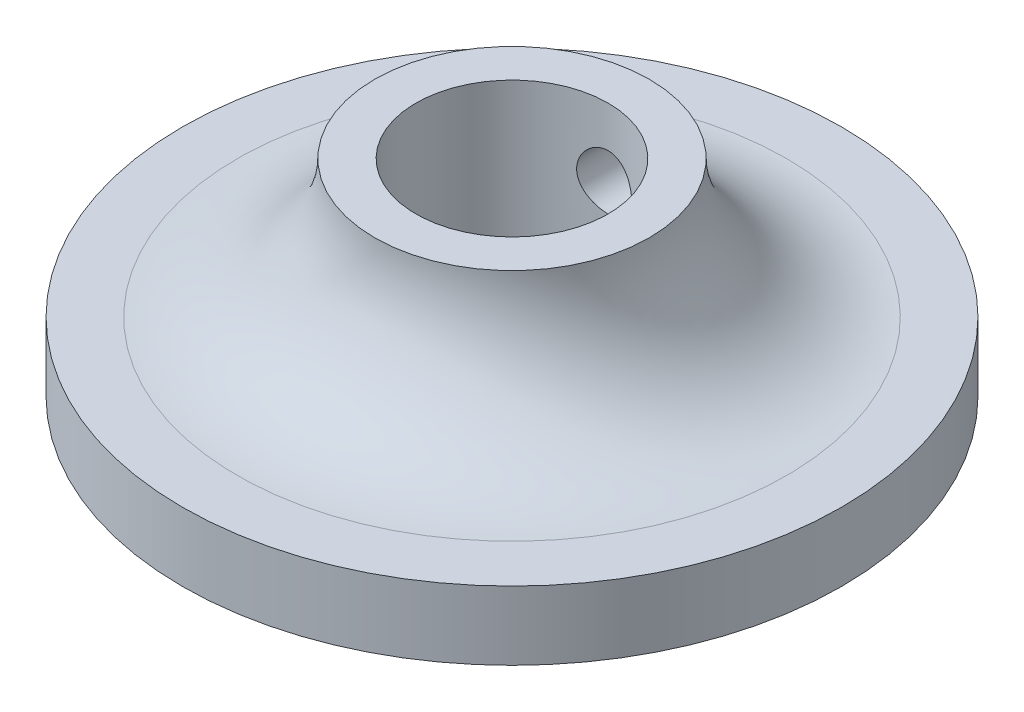
ISO-10303-21;
HEADER;
FILE_DESCRIPTION(('STEP AP214'),'2;1');
FILE_NAME('part.step','',(''),(''),'','','');
FILE_SCHEMA(('AUTOMOTIVE_DESIGN { 1 0 10303 214 1 1 1 1 }'));
ENDSEC;
DATA;
#1=APPLICATION_CONTEXT('core data for automotive mechanical design processes');
#2=APPLICATION_PROTOCOL_DEFINITION('international standard','automotive_design',2000,#1);
#3=PRODUCT_CONTEXT('',#1,'mechanical');
#4=PRODUCT('Part','Part','',(#3));
#5=PRODUCT_RELATED_PRODUCT_CATEGORY('part','',(#4));
#6=PRODUCT_DEFINITION_FORMATION('','',#4);
#7=PRODUCT_DEFINITION_CONTEXT('part definition',#1,'design');
#8=PRODUCT_DEFINITION('design','',#6,#7);
#9=PRODUCT_DEFINITION_SHAPE('','',#8);
#10=(LENGTH_UNIT() NAMED_UNIT(*) SI_UNIT(.MILLI.,.METRE.));
#11=(NAMED_UNIT(*) PLANE_ANGLE_UNIT() SI_UNIT($,.RADIAN.));
#12=(NAMED_UNIT(*) SI_UNIT($,.STERADIAN.) SOLID_ANGLE_UNIT());
#13=UNCERTAINTY_MEASURE_WITH_UNIT(LENGTH_MEASURE(1.E-05),#10,'distance_accuracy_value','');
#14=(GEOMETRIC_REPRESENTATION_CONTEXT(3) GLOBAL_UNCERTAINTY_ASSIGNED_CONTEXT((#13)) GLOBAL_UNIT_ASSIGNED_CONTEXT((#10,
#11,#12)) REPRESENTATION_CONTEXT('',''));
#15=CARTESIAN_POINT('',(0.,0.,0.));
#16=DIRECTION('',(0.,0.,1.));
#17=DIRECTION('',(1.,0.,0.));
#18=AXIS2_PLACEMENT_3D('',#15,#16,#17);
#19=CARTESIAN_POINT('',(0.,0.,0.));
#20=DIRECTION('',(0.,-1.,0.));
#21=DIRECTION('',(0.,0.,-1.));
#22=AXIS2_PLACEMENT_3D('',#19,#20,#21);
#23=CYLINDRICAL_SURFACE('',#22,35.);
#24=CARTESIAN_POINT('',(0.,75.,0.));
#25=DIRECTION('',(0.,-1.,0.));
#26=DIRECTION('',(0.,0.,-1.));
#27=AXIS2_PLACEMENT_3D('',#24,#25,#26);
#28=CIRCLE('',#27,35.);
#29=CARTESIAN_POINT('',(0.,75.,-35.));
#30=VERTEX_POINT('',#29);
#31=EDGE_CURVE('E51',#30,#30,#28,.T.);
#32=ORIENTED_EDGE('',*,*,#31,.F.);
#33=EDGE_LOOP('',(#32));
#34=FACE_BOUND('',#33,.T.);
#35=CARTESIAN_POINT('',(0.,25.,0.));
#36=DIRECTION('',(0.,-1.,0.));
#37=DIRECTION('',(0.,0.,-1.));
#38=AXIS2_PLACEMENT_3D('',#35,#36,#37);
#39=CIRCLE('',#38,35.);
#40=CARTESIAN_POINT('',(0.,25.,-35.));
#41=VERTEX_POINT('',#40);
#42=EDGE_CURVE('E10',#41,#41,#39,.T.);
#43=ORIENTED_EDGE('',*,*,#42,.T.);
#44=EDGE_LOOP('',(#43));
#45=FACE_BOUND('',#44,.T.);
#46=CARTESIAN_POINT('',(0.,60.,-35.));
#47=CARTESIAN_POINT('',(-0.274901556005326,59.9999992496795,-34.9999995349942));
#48=CARTESIAN_POINT('',(-0.549816834208974,59.9886549509865,-34.9967534260573));
#49=CARTESIAN_POINT('',(-1.09763859312636,59.9433768224279,-34.9838573930637));
#50=CARTESIAN_POINT('',(-1.37054493873051,59.9094414869984,-34.9742070422009));
#51=CARTESIAN_POINT('',(-1.91244857857752,59.8192673804053,-34.9487645309711));
#52=CARTESIAN_POINT('',(-2.18144454565832,59.7630212121843,-34.9329703336728));
#53=CARTESIAN_POINT('',(-2.71351961664384,59.6287122288909,-34.8956722555232));
#54=CARTESIAN_POINT('',(-2.97659879667574,59.5506496946882,-34.8741684481792));
#55=CARTESIAN_POINT('',(-3.49466661736327,59.3734810405891,-34.8260663007465));
#56=CARTESIAN_POINT('',(-3.74966621721336,59.2744049631793,-34.7994752390279));
#57=CARTESIAN_POINT('',(-4.25027905548096,59.0559217015017,-34.7418856596069));
#58=CARTESIAN_POINT('',(-4.49589227439499,58.9365144749917,-34.710887132747));
#59=CARTESIAN_POINT('',(-4.97613714950347,58.6782707520429,-34.6452997477994));
#60=CARTESIAN_POINT('',(-5.21077010660211,58.5394365650608,-34.6107113166018));
#61=CARTESIAN_POINT('',(-5.66772265114487,58.2432448456432,-34.5388251629476));
#62=CARTESIAN_POINT('',(-5.89003746970789,58.0858802119456,-34.5015264039459));
#63=CARTESIAN_POINT('',(-6.32592675936229,57.7498470494656,-34.4243050679413));
#64=CARTESIAN_POINT('',(-6.53917776732203,57.570768215564,-34.3843416459844));
#65=CARTESIAN_POINT('',(-6.95002921590175,57.1954532030034,-34.3036579972132));
#66=CARTESIAN_POINT('',(-7.14762246196099,56.9992092232896,-34.2629374329894));
#67=CARTESIAN_POINT('',(-7.52582469969114,56.5908587822696,-34.1818574635198));
#68=CARTESIAN_POINT('',(-7.70643113585795,56.3787499428353,-34.141498113439));
#69=CARTESIAN_POINT('',(-8.04936626216634,55.9401318395105,-34.0622763301484));
#70=CARTESIAN_POINT('',(-8.21170312342184,55.7136290848293,-34.0234132328936));
#71=CARTESIAN_POINT('',(-8.52023034045642,55.2427587899568,-33.9474806370998));
#72=CARTESIAN_POINT('',(-8.6660194338689,54.9981194454462,-33.9104645422292));
#73=CARTESIAN_POINT('',(-8.93634679576845,54.4969689233727,-33.8402306801851));
#74=CARTESIAN_POINT('',(-9.06089343601827,54.2404624736015,-33.8070114183701));
#75=CARTESIAN_POINT('',(-9.28780934205017,53.7172448822886,-33.7453764473668));
#76=CARTESIAN_POINT('',(-9.39017775956498,53.4505333508844,-33.7169609219197));
#77=CARTESIAN_POINT('',(-9.57184841023876,52.9088348202587,-33.6658377995532));
#78=CARTESIAN_POINT('',(-9.65115138156789,52.6338480861817,-33.6431300199704));
#79=CARTESIAN_POINT('',(-9.78424265867768,52.0847864821874,-33.6046614796327));
#80=CARTESIAN_POINT('',(-9.83863283932792,51.8108688962543,-33.588737575942));
#81=CARTESIAN_POINT('',(-9.92433812994149,51.259143883521,-33.56351464594));
#82=CARTESIAN_POINT('',(-9.95565360015434,50.9813365175184,-33.5542155162009));
#83=CARTESIAN_POINT('',(-9.9949122727242,50.4239824335916,-33.5425423887174));
#84=CARTESIAN_POINT('',(-10.0028598891723,50.1444360541588,-33.5401670830921));
#85=CARTESIAN_POINT('',(-9.99531923955365,49.5856907616718,-33.5424150939696));
#86=CARTESIAN_POINT('',(-9.97983142163665,49.3064918420754,-33.5470382766421));
#87=CARTESIAN_POINT('',(-9.92645114096171,48.7596011657621,-33.5628709479271));
#88=CARTESIAN_POINT('',(-9.88930230639194,48.4918300803793,-33.5738617577481));
#89=CARTESIAN_POINT('',(-9.79353170780366,47.9604882583505,-33.6019229058669));
#90=CARTESIAN_POINT('',(-9.73491047739392,47.6969174174944,-33.6189930930863));
#91=CARTESIAN_POINT('',(-9.5966956755686,47.1758022559592,-33.6587075479779));
#92=CARTESIAN_POINT('',(-9.51710455259157,46.9182572355268,-33.6813511648778));
#93=CARTESIAN_POINT('',(-9.33755032554643,46.4107616193247,-33.7315703667606));
#94=CARTESIAN_POINT('',(-9.23757954249699,46.1608139271139,-33.7591478103105));
#95=CARTESIAN_POINT('',(-9.01669015254577,45.6671821071681,-33.8188193066451));
#96=CARTESIAN_POINT('',(-8.8955293819096,45.4236125876442,-33.8509646647343));
#97=CARTESIAN_POINT('',(-8.6339614858236,44.9474232972942,-33.9186225401587));
#98=CARTESIAN_POINT('',(-8.49354775248506,44.7148073228635,-33.9541362122511));
#99=CARTESIAN_POINT('',(-8.19446313906339,44.2620219679439,-34.0275546504394));
#100=CARTESIAN_POINT('',(-8.03579198460907,44.0418527745785,-34.065459452465));
#101=CARTESIAN_POINT('',(-7.70121966473614,43.6152762324716,-34.1426519739269));
#102=CARTESIAN_POINT('',(-7.52531805836192,43.4088692361548,-34.1819397287386));
#103=CARTESIAN_POINT('',(-7.15039632731337,43.0035072628439,-34.2623694377238));
#104=CARTESIAN_POINT('',(-6.95075264384343,42.8051312821963,-34.3035252288492));
#105=CARTESIAN_POINT('',(-6.53544484829141,42.4258986382692,-34.3850653609806));
#106=CARTESIAN_POINT('',(-6.31978597427865,42.2450362910284,-34.4254499488377));
#107=CARTESIAN_POINT('',(-5.87367708568067,41.9019053725441,-34.5043655059927));
#108=CARTESIAN_POINT('',(-5.64322075432854,41.7396448255109,-34.5428956712261));
#109=CARTESIAN_POINT('',(-5.16918751072518,41.4350222647635,-34.6170047590679));
#110=CARTESIAN_POINT('',(-4.92561577633336,41.2926524769783,-34.6525848324623));
#111=CARTESIAN_POINT('',(-4.42542654252326,41.0280372929059,-34.7200178977534));
#112=CARTESIAN_POINT('',(-4.16874126057557,40.9059140703222,-34.7518479496296));
#113=CARTESIAN_POINT('',(-3.64542161894954,40.6837937404641,-34.8106337376445));
#114=CARTESIAN_POINT('',(-3.3787871781783,40.5837968135812,-34.8375894340433));
#115=CARTESIAN_POINT('',(-2.83754701708411,40.4068057951023,-34.8858441393398));
#116=CARTESIAN_POINT('',(-2.56294294198026,40.3298069924076,-34.9071443066569));
#117=CARTESIAN_POINT('',(-2.00776806951057,40.1994816479653,-34.9434720173998));
#118=CARTESIAN_POINT('',(-1.72719746843721,40.1461543287094,-34.9584997668471));
#119=CARTESIAN_POINT('',(-1.1715290272677,40.0650237711611,-34.9814564117019));
#120=CARTESIAN_POINT('',(-0.896553866474544,40.0364401414484,-34.989602141161));
#121=CARTESIAN_POINT('',(-0.345067646649962,40.0021376642701,-34.9993853927253));
#122=CARTESIAN_POINT('',(-0.0685566213768936,39.9964183162227,-35.0010230573156));
#123=CARTESIAN_POINT('',(0.483918683797081,40.0078952900172,-34.9977446058211));
#124=CARTESIAN_POINT('',(0.759883020049634,40.0250891121581,-34.9928292046398));
#125=CARTESIAN_POINT('',(1.30925255364139,40.082231883301,-34.9765832409262));
#126=CARTESIAN_POINT('',(1.58265776637142,40.1221806953626,-34.9652527170003));
#127=CARTESIAN_POINT('',(2.11938308034803,40.2234323903743,-34.9367853339199));
#128=CARTESIAN_POINT('',(2.38279515674155,40.2842834392654,-34.9197715263781));
#129=CARTESIAN_POINT('',(2.90354771404353,40.4270001943624,-34.8803329081056));
#130=CARTESIAN_POINT('',(3.1608859766315,40.5088734526263,-34.8579061529916));
#131=CARTESIAN_POINT('',(3.66765986565095,40.6929627625181,-34.8082331236944));
#132=CARTESIAN_POINT('',(3.91709642523066,40.7951764015977,-34.7809874211233));
#133=CARTESIAN_POINT('',(4.40651944086205,41.0191858885431,-34.7223752235505));
#134=CARTESIAN_POINT('',(4.64650545228472,41.140982656388,-34.6910085349651));
#135=CARTESIAN_POINT('',(5.12061162673057,41.4061248138826,-34.6242383471649));
#136=CARTESIAN_POINT('',(5.35449296067473,41.5498789876349,-34.5887622610422));
#137=CARTESIAN_POINT('',(5.80938889613202,41.855912929793,-34.5152733800743));
#138=CARTESIAN_POINT('',(6.03040296540175,42.018193463705,-34.4772604804353));
#139=CARTESIAN_POINT('',(6.45824398273693,42.3602285939767,-34.3996855714484));
#140=CARTESIAN_POINT('',(6.6650683176308,42.5399863942829,-34.3601232788613));
#141=CARTESIAN_POINT('',(7.06322625388594,42.9158076061519,-34.2804909969692));
#142=CARTESIAN_POINT('',(7.25455959472322,43.111871291831,-34.2404209991389));
#143=CARTESIAN_POINT('',(7.6265940410285,43.5258179896819,-34.1595154417031));
#144=CARTESIAN_POINT('',(7.80673615052604,43.7442074385246,-34.1186982362244));
#145=CARTESIAN_POINT('',(8.14792419429743,44.1955764234525,-34.03883115914));
#146=CARTESIAN_POINT('',(8.30897846525841,44.4285495216243,-33.9997805206214));
#147=CARTESIAN_POINT('',(8.61099897752669,44.9077567774345,-33.9245476943362));
#148=CARTESIAN_POINT('',(8.75195677962636,45.1539964467105,-33.8883667144525));
#149=CARTESIAN_POINT('',(9.01258132962313,45.6579033263044,-33.8199871701866));
#150=CARTESIAN_POINT('',(9.13225679618834,45.9155658027811,-33.7877869766639));
#151=CARTESIAN_POINT('',(9.34885994271782,46.4392836919243,-33.7284949434232));
#152=CARTESIAN_POINT('',(9.44590158865572,46.705289052782,-33.7013776521628));
#153=CARTESIAN_POINT('',(9.61719600143263,47.2450572157403,-33.6528969729375));
#154=CARTESIAN_POINT('',(9.69144877180138,47.5188200166392,-33.6315335840815));
#155=CARTESIAN_POINT('',(9.81647741141718,48.0720059069678,-33.5952528631857));
#156=CARTESIAN_POINT('',(9.8672592430445,48.3514275400231,-33.5803338941171));
#157=CARTESIAN_POINT('',(9.94489151234602,48.9138544770469,-33.5574250977651));
#158=CARTESIAN_POINT('',(9.97174275400544,49.1968596602965,-33.5494350376944));
#159=CARTESIAN_POINT('',(10.0006980595713,49.7535105808398,-33.5408146926477));
#160=CARTESIAN_POINT('',(10.003698824084,50.0271059355003,-33.5399177366807));
#161=CARTESIAN_POINT('',(9.98727921322831,50.5735579571338,-33.5448107573299));
#162=CARTESIAN_POINT('',(9.96785943216973,50.8464146434948,-33.5506005566979));
#163=CARTESIAN_POINT('',(9.90677666105822,51.3893939712228,-33.5686875813786));
#164=CARTESIAN_POINT('',(9.86511454604279,51.6595167197198,-33.5809845506922));
#165=CARTESIAN_POINT('',(9.75991646407293,52.195111388414,-33.6117096790817));
#166=CARTESIAN_POINT('',(9.69638038925877,52.4605832856713,-33.6301378683904));
#167=CARTESIAN_POINT('',(9.54875094611984,52.9822953528121,-33.672350352576));
#168=CARTESIAN_POINT('',(9.46487888929798,53.2386029281119,-33.6960767819299));
#169=CARTESIAN_POINT('',(9.27687660192877,53.743273690527,-33.7483195836135));
#170=CARTESIAN_POINT('',(9.17273910125669,53.9916339892536,-33.7768376744244));
#171=CARTESIAN_POINT('',(8.94501049329059,54.4787349301378,-33.8378585821611));
#172=CARTESIAN_POINT('',(8.8214206211707,54.7174761818711,-33.8703611460545));
#173=CARTESIAN_POINT('',(8.55564435793811,55.1839183013582,-33.9384702309865));
#174=CARTESIAN_POINT('',(8.41345692322028,55.4116185485606,-33.9740769261764));
#175=CARTESIAN_POINT('',(8.10638321721884,55.8620215755804,-34.0486759443048));
#176=CARTESIAN_POINT('',(7.94089768695976,56.0843038299699,-34.0877416056887));
#177=CARTESIAN_POINT('',(7.59217958807411,56.5142480855476,-34.1671007893326));
#178=CARTESIAN_POINT('',(7.40894667258038,56.721909800845,-34.2073943355809));
#179=CARTESIAN_POINT('',(7.02586237623384,57.1213661022169,-34.2881258662737));
#180=CARTESIAN_POINT('',(6.82600684312654,57.3131566997456,-34.3285638843779));
#181=CARTESIAN_POINT('',(6.41097556869321,57.6795847650153,-34.4084879627462));
#182=CARTESIAN_POINT('',(6.19580012084011,57.8542225611881,-34.4479740412265));
#183=CARTESIAN_POINT('',(5.74569910795144,58.1894879659179,-34.5259386331858));
#184=CARTESIAN_POINT('',(5.51040619604641,58.3496351310044,-34.5643645060219));
#185=CARTESIAN_POINT('',(5.02674726936588,58.6494353394289,-34.6380082630153));
#186=CARTESIAN_POINT('',(4.77838606147992,58.7890958477245,-34.6732273138958));
#187=CARTESIAN_POINT('',(4.27027028054489,59.0468739441396,-34.7394647435523));
#188=CARTESIAN_POINT('',(4.01051884161307,59.164997412784,-34.7704842683796));
#189=CARTESIAN_POINT('',(3.48140205835312,59.37876491402,-34.8274404222057));
#190=CARTESIAN_POINT('',(3.21203780889826,59.4744114973156,-34.8533776278967));
#191=CARTESIAN_POINT('',(2.70177833764652,59.6312996690821,-34.8963756402951));
#192=CARTESIAN_POINT('',(2.4618233893793,59.6954171955445,-34.9141564288628));
#193=CARTESIAN_POINT('',(1.97743233435039,59.8056855583901,-34.9449375290137));
#194=CARTESIAN_POINT('',(1.73299491879246,59.8518310569182,-34.9579364202668));
#195=CARTESIAN_POINT('',(1.24117120949031,59.925791040851,-34.9788517233327));
#196=CARTESIAN_POINT('',(0.993785218650305,59.9536073929453,-34.986768652704));
#197=CARTESIAN_POINT('',(0.497602900694159,59.9907091278373,-34.9973421259512));
#198=CARTESIAN_POINT('',(0.248807070714871,60.0000006790978,-35.000000420866));
#199=CARTESIAN_POINT('',(0.,60.,-35.));
#200=B_SPLINE_CURVE_WITH_KNOTS('',3,(#46,#47,#48,#49,#50,#51,#52,#53,#54,#55,#56,#57,#58,#59,
#60,#61,#62,#63,#64,#65,#66,#67,#68,#69,#70,#71,#72,#73,#74,#75,#76,#77,#78,#79,#80,#81,#82,#83,
#84,#85,#86,#87,#88,#89,#90,#91,#92,#93,#94,#95,#96,#97,#98,#99,#100,#101,#102,#103,#104,#105,
#106,#107,#108,#109,#110,#111,#112,#113,#114,#115,#116,#117,#118,#119,#120,#121,#122,#123,#124,
#125,#126,#127,#128,#129,#130,#131,#132,#133,#134,#135,#136,#137,#138,#139,#140,#141,#142,#143,
#144,#145,#146,#147,#148,#149,#150,#151,#152,#153,#154,#155,#156,#157,#158,#159,#160,#161,#162,
#163,#164,#165,#166,#167,#168,#169,#170,#171,#172,#173,#174,#175,#176,#177,#178,#179,#180,#181,
#182,#183,#184,#185,#186,#187,#188,#189,#190,#191,#192,#193,#194,#195,#196,#197,#198,#199),
.UNSPECIFIED.,.T.,.F.,(4,2,2,2,2,2,2,2,2,2,2,2,2,2,2,2,2,2,2,2,2,2,2,2,2,2,2,2,2,2,2,2,2,2,2,2,
2,2,2,2,2,2,2,2,2,2,2,2,2,2,2,2,2,2,2,2,2,2,2,2,2,2,2,2,2,2,2,2,2,2,2,2,2,2,2,2,4),(0.,
0.824476293243495,1.64900753863597,2.47381238249174,3.29860660808281,4.12222950216586,
4.94585410751967,5.76938088429255,6.59322428748663,7.4362252883258,8.27961141901587,
9.12312422686598,9.96625825945145,10.8267518093041,11.6869054465494,12.5470919769362,
13.4072509754946,14.245362981385,15.0834619021349,15.9214024992868,16.7593270729229,
17.5700506587097,18.3807540986374,19.1913629229835,20.0022777481984,20.8231506027146,
21.6443059009047,22.4654735409689,23.2866622015568,24.1389767473028,24.9910137449999,
25.8434169116183,26.6954859888174,27.5525230006538,28.4095669994937,29.2664353147641,
30.1232754834392,30.951988993675,31.7806843602755,32.6092893281644,33.4378893095329,
34.2496007799973,35.0616042601895,35.8735114869609,36.6854568667832,37.5149482124367,
38.3444738449486,39.1741518345254,40.003843774539,40.8609073507723,41.7175952108682,
42.5746417710524,43.4313364147381,44.283619520394,45.1359024940407,45.9879688409892,
46.8400065603702,47.65985137796,48.4796744641177,49.2994652999233,50.1192601781473,
50.9305050765941,51.7420415433137,52.5535265003877,53.3650570136189,54.2036764473376,
55.0423122749222,55.8811582227384,56.7199881056889,57.5805593547237,58.4408162444477,
59.3008378946594,60.1607619013993,60.9070795655757,61.65361872412,62.4000818413469,
63.1462963567416),.UNSPECIFIED.);
#201=CARTESIAN_POINT('',(0.,60.,-35.));
#202=VERTEX_POINT('',#201);
#203=EDGE_CURVE('E74',#202,#202,#200,.T.);
#204=ORIENTED_EDGE('',*,*,#203,.F.);
#205=EDGE_LOOP('',(#204));
#206=FACE_BOUND('',#205,.T.);
#207=ADVANCED_FACE('F37',(#34,#45,#206),#23,.F.);
#208=CARTESIAN_POINT('',(0.,75.,0.));
#209=DIRECTION('',(0.,-1.,0.));
#210=DIRECTION('',(0.,0.,-1.));
#211=AXIS2_PLACEMENT_3D('',#208,#209,#210);
#212=TOROIDAL_SURFACE('',#211,100.,50.);
#213=CARTESIAN_POINT('',(0.,25.,0.));
#214=DIRECTION('',(0.,-1.,0.));
#215=DIRECTION('',(0.,0.,-1.));
#216=AXIS2_PLACEMENT_3D('',#213,#214,#215);
#217=CIRCLE('',#216,100.);
#218=CARTESIAN_POINT('',(0.,25.,-100.));
#219=VERTEX_POINT('',#218);
#220=EDGE_CURVE('E62',#219,#219,#217,.T.);
#221=ORIENTED_EDGE('',*,*,#220,.F.);
#222=EDGE_LOOP('',(#221));
#223=FACE_BOUND('',#222,.T.);
#224=CARTESIAN_POINT('',(0.,75.,0.));
#225=DIRECTION('',(0.,-1.,0.));
#226=DIRECTION('',(0.,0.,-1.));
#227=AXIS2_PLACEMENT_3D('',#224,#225,#226);
#228=CIRCLE('',#227,50.);
#229=CARTESIAN_POINT('',(0.,75.,-50.));
#230=VERTEX_POINT('',#229);
#231=EDGE_CURVE('E56',#230,#230,#228,.T.);
#232=ORIENTED_EDGE('',*,*,#231,.T.);
#233=EDGE_LOOP('',(#232));
#234=FACE_BOUND('',#233,.T.);
#235=CARTESIAN_POINT('',(-2.34256807953686,40.2782524825659,-63.9793540771989));
#236=CARTESIAN_POINT('',(-2.60252990347501,40.3408965153336,-63.9093373017325));
#237=CARTESIAN_POINT('',(-2.85735900679411,40.4133521972021,-63.8287301755813));
#238=CARTESIAN_POINT('',(-3.35483309486049,40.5758963828728,-63.6493089845902));
#239=CARTESIAN_POINT('',(-3.59746528462061,40.6660029372155,-63.5504762876142));
#240=CARTESIAN_POINT('',(-4.07048294904702,40.8623276363696,-63.3371102092378));
#241=CARTESIAN_POINT('',(-4.30080273256107,40.9686224152115,-63.2225024118954));
#242=CARTESIAN_POINT('',(-4.74741992513852,41.195187780536,-62.9807610413924));
#243=CARTESIAN_POINT('',(-4.96371939180911,41.3154563089779,-62.8536293131631));
#244=CARTESIAN_POINT('',(-5.43955018330825,41.6030784178233,-62.5530982253964));
#245=CARTESIAN_POINT('',(-5.6947436564515,41.7743178635845,-62.3765488562773));
#246=CARTESIAN_POINT('',(-6.18283804157011,42.1345960003315,-62.0112114558229));
#247=CARTESIAN_POINT('',(-6.41573081301084,42.3236411414445,-61.8224189971925));
#248=CARTESIAN_POINT('',(-6.85955061666909,42.7175185625853,-61.4361434223081));
#249=CARTESIAN_POINT('',(-7.07048967986581,42.9223420875636,-61.2386651513352));
#250=CARTESIAN_POINT('',(-7.47095611840668,43.3464396817427,-60.8377420942557));
#251=CARTESIAN_POINT('',(-7.66048557372555,43.5657123439058,-60.6342978901713));
#252=CARTESIAN_POINT('',(-8.02297626415276,44.0234424471477,-60.2185315297563));
#253=CARTESIAN_POINT('',(-8.19539083188138,44.2622468032551,-60.0061153289317));
#254=CARTESIAN_POINT('',(-8.51797497820213,44.7530637018587,-59.5796738446309));
#255=CARTESIAN_POINT('',(-8.66814434614967,45.0050763693965,-59.3656485459379));
#256=CARTESIAN_POINT('',(-8.94604585636403,45.5217877421892,-58.9378010472468));
#257=CARTESIAN_POINT('',(-9.0737585071762,45.7864972165948,-58.7239791823333));
#258=CARTESIAN_POINT('',(-9.305963439357,46.3277040813827,-58.2986050706935));
#259=CARTESIAN_POINT('',(-9.41045360330538,46.6042025439447,-58.0870530326019));
#260=CARTESIAN_POINT('',(-9.61179395578283,47.2186692652938,-57.6306038331056));
#261=CARTESIAN_POINT('',(-9.70394073564547,47.5587914073821,-57.386504840036));
#262=CARTESIAN_POINT('',(-9.85259229384638,48.2528896146184,-56.9070455347515));
#263=CARTESIAN_POINT('',(-9.90908914540318,48.6068687423059,-56.6716871769627));
#264=CARTESIAN_POINT('',(-9.98378346339622,49.3258577443021,-56.213292783588));
#265=CARTESIAN_POINT('',(-10.0020477759561,49.6908472322819,-55.9902359061654));
#266=CARTESIAN_POINT('',(-9.99759106324627,50.42934628718,-55.5592604781089));
#267=CARTESIAN_POINT('',(-9.97489242727132,50.8028510896803,-55.3513337223572));
#268=CARTESIAN_POINT('',(-9.89964923141324,51.4369038748724,-55.0157659807529));
#269=CARTESIAN_POINT('',(-9.85863145817877,51.6963215129088,-54.8833221960254));
#270=CARTESIAN_POINT('',(-9.75507556747488,52.2155190686057,-54.6279493732333));
#271=CARTESIAN_POINT('',(-9.6925429039166,52.4752988778522,-54.5050179335039));
#272=CARTESIAN_POINT('',(-9.54535662526937,52.9930849547519,-54.2695314353505));
#273=CARTESIAN_POINT('',(-9.46071802903474,53.2510923049441,-54.15696940188));
#274=CARTESIAN_POINT('',(-9.26890651125878,53.7632618763372,-53.9427338004024));
#275=CARTESIAN_POINT('',(-9.16173278430142,54.0174239597583,-53.8410606217641));
#276=CARTESIAN_POINT('',(-8.92423319357673,54.5205990126526,-53.6485308288469));
#277=CARTESIAN_POINT('',(-8.79380073981844,54.7695821183584,-53.5577273740969));
#278=CARTESIAN_POINT('',(-8.5104491614908,55.2585251484019,-53.3875876814665));
#279=CARTESIAN_POINT('',(-8.35752991249314,55.4984850228013,-53.308251507044));
#280=CARTESIAN_POINT('',(-8.0299196921851,55.9667448246311,-53.1608284404809));
#281=CARTESIAN_POINT('',(-7.85522733002694,56.1950440058718,-53.0927422676275));
#282=CARTESIAN_POINT('',(-7.48518752434362,56.6374020624904,-52.9673199929185));
#283=CARTESIAN_POINT('',(-7.28984125637266,56.8514617472063,-52.9099832797526));
#284=CARTESIAN_POINT('',(-6.89558975598605,57.2472628288226,-52.8092946902045));
#285=CARTESIAN_POINT('',(-6.69809317164114,57.4302239234761,-52.7652095903052));
#286=CARTESIAN_POINT('',(-6.28805748761881,57.7802951687799,-52.6848210459104));
#287=CARTESIAN_POINT('',(-6.07551923024724,57.9474062057796,-52.6485171661389));
#288=CARTESIAN_POINT('',(-5.63690091920384,58.2642937126086,-52.5828715944482));
#289=CARTESIAN_POINT('',(-5.41082154616759,58.4140710525975,-52.5535295529638));
#290=CARTESIAN_POINT('',(-4.94671359551154,58.6950337103335,-52.5009563316696));
#291=CARTESIAN_POINT('',(-4.70868480899317,58.8262187028976,-52.4777252587354));
#292=CARTESIAN_POINT('',(-4.22289049350191,59.0686677996928,-52.43659314722));
#293=CARTESIAN_POINT('',(-3.97514682990353,59.179973823439,-52.4186808385851));
#294=CARTESIAN_POINT('',(-3.47118343822146,59.3821425843952,-52.3873654683082));
#295=CARTESIAN_POINT('',(-3.21496377258125,59.4730054721733,-52.3739623734546));
#296=CARTESIAN_POINT('',(-2.69580603363015,59.6336111906181,-52.3510124374666));
#297=CARTESIAN_POINT('',(-2.43286758082892,59.7033528254429,-52.3414658146675));
#298=CARTESIAN_POINT('',(-1.90208655696979,59.821200245582,-52.3257082637897));
#299=CARTESIAN_POINT('',(-1.63424391202875,59.8693057046611,-52.3194973860078));
#300=CARTESIAN_POINT('',(-1.0902476364922,59.9442546401538,-52.3099493904151));
#301=CARTESIAN_POINT('',(-0.814033577487078,59.970667535198,-52.3066703602569));
#302=CARTESIAN_POINT('',(-0.260345207646765,60.0004543718484,-52.3029790588423));
#303=CARTESIAN_POINT('',(0.0171291190712894,60.0038280222857,-52.3025668238163));
#304=CARTESIAN_POINT('',(0.571409282995272,59.9875106659958,-52.3045817247328));
#305=CARTESIAN_POINT('',(0.848215070220421,59.9678179852143,-52.3070090667595));
#306=CARTESIAN_POINT('',(1.39919198723905,59.9055099071665,-52.3148640301992));
#307=CARTESIAN_POINT('',(1.67336311515126,59.8628944935336,-52.3202916537543));
#308=CARTESIAN_POINT('',(2.21877191431623,59.7547324695991,-52.3345325230176));
#309=CARTESIAN_POINT('',(2.48998205318046,59.6890495848663,-52.3433659198557));
#310=CARTESIAN_POINT('',(3.0258281281948,59.5353057500475,-52.3649371761184));
#311=CARTESIAN_POINT('',(3.29046402205968,59.4472446560669,-52.3776750606494));
#312=CARTESIAN_POINT('',(3.81123190787705,59.2494372666735,-52.4077274839586));
#313=CARTESIAN_POINT('',(4.06736407143636,59.1396914091743,-52.4250419303179));
#314=CARTESIAN_POINT('',(4.56924573427689,58.8994042184876,-52.4650408882832));
#315=CARTESIAN_POINT('',(4.81499533891949,58.7688630963929,-52.4877253453795));
#316=CARTESIAN_POINT('',(5.29247805723286,58.489149128786,-52.5391443450617));
#317=CARTESIAN_POINT('',(5.52430302979682,58.3401244793879,-52.567831889924));
#318=CARTESIAN_POINT('',(5.97423014336108,58.0239744834586,-52.6322464984784));
#319=CARTESIAN_POINT('',(6.1923323707641,57.8568492509124,-52.6679735178417));
#320=CARTESIAN_POINT('',(6.61317422728954,57.5060606549087,-52.7473243850898));
#321=CARTESIAN_POINT('',(6.81591772617024,57.3224014830062,-52.7909462343565));
#322=CARTESIAN_POINT('',(7.20467116332994,56.9402450873825,-52.8868805934328));
#323=CARTESIAN_POINT('',(7.39068141854546,56.7417481448269,-52.9391929385863));
#324=CARTESIAN_POINT('',(7.74115018326429,56.3360078707313,-53.0520024537404));
#325=CARTESIAN_POINT('',(7.9059694674809,56.1290238021641,-53.112311967973));
#326=CARTESIAN_POINT('',(8.2174541300989,55.7046236276536,-53.2423374151909));
#327=CARTESIAN_POINT('',(8.36411985472559,55.4872077207764,-53.3120531687271));
#328=CARTESIAN_POINT('',(8.6386353667352,55.043998994453,-53.4611236141475));
#329=CARTESIAN_POINT('',(8.76648659375964,54.8182068175965,-53.5404775676899));
#330=CARTESIAN_POINT('',(9.00301875609044,54.3602832337287,-53.7088493711738));
#331=CARTESIAN_POINT('',(9.11169941183693,54.1281517343296,-53.7978673620131));
#332=CARTESIAN_POINT('',(9.31062266272619,53.6576079531632,-53.9861513941562));
#333=CARTESIAN_POINT('',(9.40070486208842,53.4191595476964,-54.0854963067412));
#334=CARTESIAN_POINT('',(9.56146479115881,52.939780776144,-54.2934176034324));
#335=CARTESIAN_POINT('',(9.63214250245582,52.6988504077036,-54.4019939962974));
#336=CARTESIAN_POINT('',(9.75451221790547,52.2161896491327,-54.6278492749006));
#337=CARTESIAN_POINT('',(9.80619935042353,51.9744590697493,-54.7451303843895));
#338=CARTESIAN_POINT('',(9.8911425354524,51.4917669234939,-54.9877018282333));
#339=CARTESIAN_POINT('',(9.92439617166881,51.2508054615531,-55.1129932101888));
#340=CARTESIAN_POINT('',(9.97558393937311,50.7470360123337,-55.3836833651101));
#341=CARTESIAN_POINT('',(9.99165849415183,50.4844471091774,-55.5298410639427));
#342=CARTESIAN_POINT('',(10.0033300456592,49.9632506630379,-55.8298356484291));
#343=CARTESIAN_POINT('',(9.99892588947841,49.7046433450322,-55.9836729659474));
#344=CARTESIAN_POINT('',(9.97064483216372,49.1925215831282,-56.2979470844545));
#345=CARTESIAN_POINT('',(9.94676487550302,48.9390079447641,-56.4583849172368));
#346=CARTESIAN_POINT('',(9.88048709539807,48.4380015319018,-56.7847497278503));
#347=CARTESIAN_POINT('',(9.83808726380325,48.1905094134032,-56.950677299142));
#348=CARTESIAN_POINT('',(9.72610076437104,47.6568162376605,-57.3182410068881));
#349=CARTESIAN_POINT('',(9.65292286339128,47.3719838543867,-57.5207754341743));
#350=CARTESIAN_POINT('',(9.48297229794681,46.8127331448625,-57.9302756602376));
#351=CARTESIAN_POINT('',(9.386197038495,46.538315967804,-58.1372419440984));
#352=CARTESIAN_POINT('',(9.1698294907185,46.0001909038094,-58.5542087733807));
#353=CARTESIAN_POINT('',(9.05019773454228,45.7365025125921,-58.7642139779004));
#354=CARTESIAN_POINT('',(8.78890910202207,45.2210272898328,-59.185113563709));
#355=CARTESIAN_POINT('',(8.64725160588286,44.9692407934654,-59.3960079698572));
#356=CARTESIAN_POINT('',(8.31572469414192,44.4354783187165,-59.8534880792668));
#357=CARTESIAN_POINT('',(8.12175538248219,44.1558805506251,-60.0998937163592));
#358=CARTESIAN_POINT('',(7.70403243201297,43.6152830341507,-60.5881040701013));
#359=CARTESIAN_POINT('',(7.48026895446211,43.3542894732196,-60.8299072366281));
#360=CARTESIAN_POINT('',(7.00304861125674,42.8531939847014,-61.3045021841638));
#361=CARTESIAN_POINT('',(6.74964481743944,42.6130560187532,-61.5373091078798));
#362=CARTESIAN_POINT('',(6.212178179928,42.1556884608372,-61.9894939537722));
#363=CARTESIAN_POINT('',(5.92813789326905,41.9384422440001,-62.2088815723051));
#364=CARTESIAN_POINT('',(5.45071038526535,41.6133468910739,-62.5428172673154));
#365=CARTESIAN_POINT('',(5.26749026375951,41.4969654759503,-62.6636874498113));
#366=CARTESIAN_POINT('',(4.88981574475711,41.2743046042355,-62.8971082324715));
#367=CARTESIAN_POINT('',(4.6953590990889,41.1680271805523,-63.0096571574025));
#368=CARTESIAN_POINT('',(4.29559795554654,40.9668478173282,-63.2244925873158));
#369=CARTESIAN_POINT('',(4.09030896559744,40.8719302189629,-63.3267931865156));
#370=CARTESIAN_POINT('',(3.66903463843323,40.6946060022432,-63.51929473408));
#371=CARTESIAN_POINT('',(3.45305586326551,40.6121918318015,-63.6095029823758));
#372=CARTESIAN_POINT('',(3.05103266314284,40.4748862209953,-63.7606978997495));
#373=CARTESIAN_POINT('',(2.86664433099423,40.4177130667558,-63.824018466822));
#374=CARTESIAN_POINT('',(2.49181053790949,40.3134789410513,-63.9399346929655));
#375=CARTESIAN_POINT('',(2.30136810228139,40.2664130073181,-63.9925356143324));
#376=CARTESIAN_POINT('',(1.915281368325,40.1831428223153,-64.0858924504923));
#377=CARTESIAN_POINT('',(1.71963779673364,40.1469370621842,-64.1266500107214));
#378=CARTESIAN_POINT('',(1.32432597644923,40.0860630504229,-64.1953245244296));
#379=CARTESIAN_POINT('',(1.12465782772412,40.0613945125827,-64.223241796444));
#380=CARTESIAN_POINT('',(0.721569058506171,40.0240016088437,-64.2656056553996));
#381=CARTESIAN_POINT('',(0.518133223281059,40.0113487971543,-64.2799715398537));
#382=CARTESIAN_POINT('',(0.110335575757652,39.9985279673978,-64.2945283875727));
#383=CARTESIAN_POINT('',(-0.0940263305022022,39.9983612459121,-64.2947178787316));
#384=CARTESIAN_POINT('',(-0.501680090495098,40.0105123753432,-64.280921045781));
#385=CARTESIAN_POINT('',(-0.704972824879473,40.0228174574311,-64.2669492202505));
#386=CARTESIAN_POINT('',(-1.10894174276632,40.0596095490334,-64.2252622267756));
#387=CARTESIAN_POINT('',(-1.30961901054191,40.0840913342953,-64.1975529527175));
#388=CARTESIAN_POINT('',(-1.64971313558592,40.1359773582527,-64.1390114830184));
#389=CARTESIAN_POINT('',(-1.79013689231406,40.1605120956095,-64.1113738877698));
#390=CARTESIAN_POINT('',(-2.06836598877578,40.215218350346,-64.0499103851548));
#391=CARTESIAN_POINT('',(-2.20617350246745,40.2453849398405,-64.0160898883762));
#392=CARTESIAN_POINT('',(-2.34256807953686,40.2782524825659,-63.9793540771989));
#393=B_SPLINE_CURVE_WITH_KNOTS('',3,(#235,#236,#237,#238,#239,#240,#241,#242,#243,#244,#245,
#246,#247,#248,#249,#250,#251,#252,#253,#254,#255,#256,#257,#258,#259,#260,#261,#262,#263,#264,
#265,#266,#267,#268,#269,#270,#271,#272,#273,#274,#275,#276,#277,#278,#279,#280,#281,#282,#283,
#284,#285,#286,#287,#288,#289,#290,#291,#292,#293,#294,#295,#296,#297,#298,#299,#300,#301,#302,
#303,#304,#305,#306,#307,#308,#309,#310,#311,#312,#313,#314,#315,#316,#317,#318,#319,#320,#321,
#322,#323,#324,#325,#326,#327,#328,#329,#330,#331,#332,#333,#334,#335,#336,#337,#338,#339,#340,
#341,#342,#343,#344,#345,#346,#347,#348,#349,#350,#351,#352,#353,#354,#355,#356,#357,#358,#359,
#360,#361,#362,#363,#364,#365,#366,#367,#368,#369,#370,#371,#372,#373,#374,#375,#376,#377,#378,
#379,#380,#381,#382,#383,#384,#385,#386,#387,#388,#389,#390,#391,#392),.UNSPECIFIED.,.T.,.F.,(4,
2,2,2,2,2,2,2,2,2,2,2,2,2,2,2,2,2,2,2,2,2,2,2,2,2,2,2,2,2,2,2,2,2,2,2,2,2,2,2,2,2,2,2,2,2,2,2,2,
2,2,2,2,2,2,2,2,2,2,2,2,2,2,2,2,2,2,2,2,2,2,2,2,2,2,2,2,2,4),(0.,0.829045866782681,
1.65894401972103,2.49290053755849,3.32673438638862,4.38842262690495,5.45049695496151,
6.51198615034767,7.5733721316536,8.66186132402432,9.75036082287531,10.839800477919,
11.9293394270677,13.2136126150796,14.4981712614218,15.7804820912426,17.0620922551871,
17.9436862297967,18.8250568894412,19.7058302931834,20.5866351815285,21.4715855176004,
22.3565407506358,23.2415525428523,24.1265139901193,24.9439567598533,25.7613537904704,
26.5787097695686,27.3960800425901,28.2117058046946,29.0273255593463,29.8429914840865,
30.6586697072095,31.4901718739671,32.3216845491918,33.1532575757425,33.9848311960314,
34.8214024703751,35.6579791241132,36.4945388853082,37.3310901551221,38.1613219940933,
38.9915486051403,39.8215653331647,40.6515663369203,41.4647226336356,42.2778634194167,
43.0909419531719,43.9040323428775,44.7238662759525,45.5437009868906,46.3637458626259,
47.1838982058508,48.0858824255551,48.9879174257362,49.8900939719571,50.7923683674491,
51.8625722611137,52.9328938975668,54.0050807131684,55.0772977051265,56.3362314357968,
57.5955819321385,58.8527110822438,60.1089208714481,60.8537468677119,61.5987224061213,
62.3426589159744,63.0861442827893,63.695081459646,64.3037189840789,64.9122719080734,
65.5208097345827,66.1329491187324,66.7451520686096,67.3567288679641,67.9680435044666,
68.4033994642364,68.8383762568206),.UNSPECIFIED.);
#394=CARTESIAN_POINT('',(-2.34256807953686,40.2782524825659,-63.9793540771989));
#395=VERTEX_POINT('',#394);
#396=EDGE_CURVE('E41',#395,#395,#393,.T.);
#397=ORIENTED_EDGE('',*,*,#396,.F.);
#398=EDGE_LOOP('',(#397));
#399=FACE_BOUND('',#398,.T.);
#400=ADVANCED_FACE('F97',(#223,#234,#399),#212,.F.);
#401=CARTESIAN_POINT('',(-120.,0.,0.));
#402=DIRECTION('',(0.,1.,0.));
#403=DIRECTION('',(0.,0.,1.));
#404=AXIS2_PLACEMENT_3D('',#401,#402,#403);
#405=PLANE('',#404);
#406=CARTESIAN_POINT('',(0.,0.,0.));
#407=DIRECTION('',(0.,-1.,0.));
#408=DIRECTION('',(0.,0.,-1.));
#409=AXIS2_PLACEMENT_3D('',#406,#407,#408);
#410=CIRCLE('',#409,120.);
#411=CARTESIAN_POINT('',(0.,0.,-120.));
#412=VERTEX_POINT('',#411);
#413=EDGE_CURVE('E70',#412,#412,#410,.T.);
#414=ORIENTED_EDGE('',*,*,#413,.T.);
#415=EDGE_LOOP('',(#414));
#416=FACE_BOUND('',#415,.T.);
#417=ADVANCED_FACE('F39',(#416),#405,.F.);
#418=CARTESIAN_POINT('',(0.,25.,0.));
#419=DIRECTION('',(0.,-1.,0.));
#420=DIRECTION('',(0.,0.,-1.));
#421=AXIS2_PLACEMENT_3D('',#418,#419,#420);
#422=PLANE('',#421);
#423=ORIENTED_EDGE('',*,*,#42,.F.);
#424=EDGE_LOOP('',(#423));
#425=FACE_BOUND('',#424,.T.);
#426=ADVANCED_FACE('F102',(#425),#422,.F.);
#427=CARTESIAN_POINT('',(-50.,75.,0.));
#428=DIRECTION('',(0.,-1.,0.));
#429=DIRECTION('',(0.,0.,-1.));
#430=AXIS2_PLACEMENT_3D('',#427,#428,#429);
#431=PLANE('',#430);
#432=ORIENTED_EDGE('',*,*,#231,.F.);
#433=EDGE_LOOP('',(#432));
#434=FACE_BOUND('',#433,.T.);
#435=ORIENTED_EDGE('',*,*,#31,.T.);
#436=EDGE_LOOP('',(#435));
#437=FACE_BOUND('',#436,.T.);
#438=ADVANCED_FACE('F95',(#434,#437),#431,.F.);
#439=CARTESIAN_POINT('',(-120.,25.,0.));
#440=DIRECTION('',(0.,-1.,0.));
#441=DIRECTION('',(0.,0.,-1.));
#442=AXIS2_PLACEMENT_3D('',#439,#440,#441);
#443=PLANE('',#442);
#444=CARTESIAN_POINT('',(0.,25.,0.));
#445=DIRECTION('',(0.,-1.,0.));
#446=DIRECTION('',(0.,0.,-1.));
#447=AXIS2_PLACEMENT_3D('',#444,#445,#446);
#448=CIRCLE('',#447,120.);
#449=CARTESIAN_POINT('',(0.,25.,-120.));
#450=VERTEX_POINT('',#449);
#451=EDGE_CURVE('E66',#450,#450,#448,.T.);
#452=ORIENTED_EDGE('',*,*,#451,.F.);
#453=EDGE_LOOP('',(#452));
#454=FACE_BOUND('',#453,.T.);
#455=ORIENTED_EDGE('',*,*,#220,.T.);
#456=EDGE_LOOP('',(#455));
#457=FACE_BOUND('',#456,.T.);
#458=ADVANCED_FACE('F92',(#454,#457),#443,.F.);
#459=CARTESIAN_POINT('',(0.,0.,0.));
#460=DIRECTION('',(0.,-1.,0.));
#461=DIRECTION('',(0.,0.,-1.));
#462=AXIS2_PLACEMENT_3D('',#459,#460,#461);
#463=CYLINDRICAL_SURFACE('',#462,120.);
#464=ORIENTED_EDGE('',*,*,#413,.F.);
#465=EDGE_LOOP('',(#464));
#466=FACE_BOUND('',#465,.T.);
#467=ORIENTED_EDGE('',*,*,#451,.T.);
#468=EDGE_LOOP('',(#467));
#469=FACE_BOUND('',#468,.T.);
#470=ADVANCED_FACE('F87',(#466,#469),#463,.T.);
#471=CARTESIAN_POINT('',(0.,50.,-10.));
#472=DIRECTION('',(0.,0.,-1.));
#473=DIRECTION('',(-1.,0.,0.));
#474=AXIS2_PLACEMENT_3D('',#471,#472,#473);
#475=CYLINDRICAL_SURFACE('',#474,10.);
#476=ORIENTED_EDGE('',*,*,#396,.T.);
#477=EDGE_LOOP('',(#476));
#478=FACE_BOUND('',#477,.T.);
#479=ORIENTED_EDGE('',*,*,#203,.T.);
#480=EDGE_LOOP('',(#479));
#481=FACE_BOUND('',#480,.T.);
#482=ADVANCED_FACE('F83',(#478,#481),#475,.F.);
#483=CLOSED_SHELL('',(#207,#400,#417,#426,#438,#458,#470,#482));
#484=MANIFOLD_SOLID_BREP('B2',#483);
#485=ADVANCED_BREP_SHAPE_REPRESENTATION('',(#18,#484),#14);
#486=SHAPE_DEFINITION_REPRESENTATION(#9,#485);
ENDSEC;
END-ISO-10303-21;
